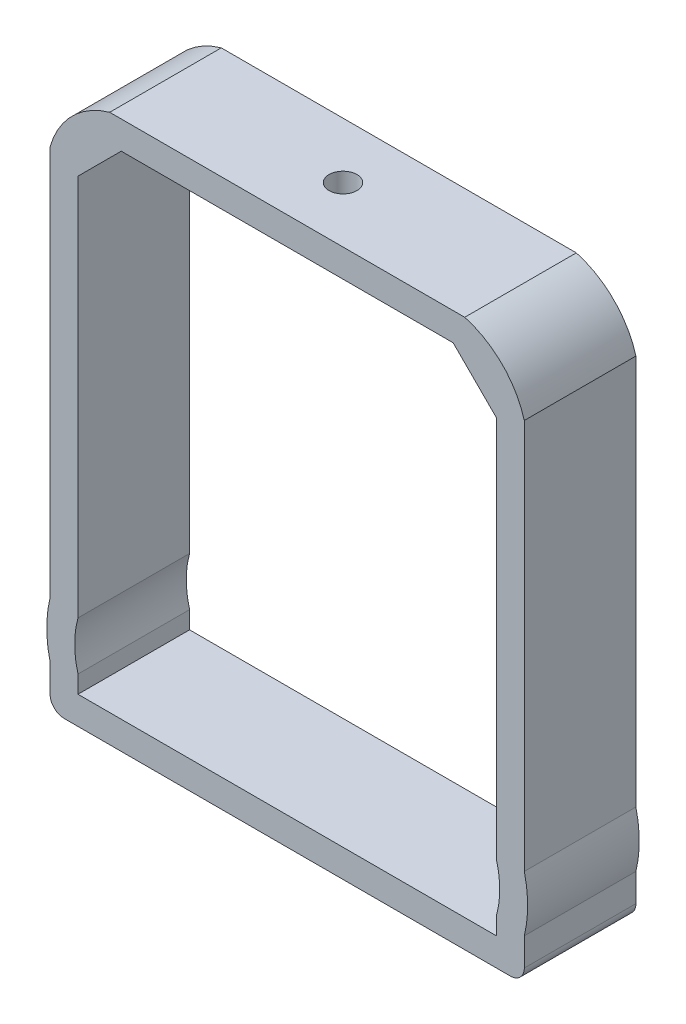
ISO-10303-21;
HEADER;
FILE_DESCRIPTION(('STEP AP214'),'2;1');
FILE_NAME('part.step','',(''),(''),'','','');
FILE_SCHEMA(('AUTOMOTIVE_DESIGN { 1 0 10303 214 1 1 1 1 }'));
ENDSEC;
DATA;
#1=APPLICATION_CONTEXT('core data for automotive mechanical design processes');
#2=APPLICATION_PROTOCOL_DEFINITION('international standard','automotive_design',2000,#1);
#3=PRODUCT_CONTEXT('',#1,'mechanical');
#4=PRODUCT('Part','Part','',(#3));
#5=PRODUCT_RELATED_PRODUCT_CATEGORY('part','',(#4));
#6=PRODUCT_DEFINITION_FORMATION('','',#4);
#7=PRODUCT_DEFINITION_CONTEXT('part definition',#1,'design');
#8=PRODUCT_DEFINITION('design','',#6,#7);
#9=PRODUCT_DEFINITION_SHAPE('','',#8);
#10=(LENGTH_UNIT() NAMED_UNIT(*) SI_UNIT(.MILLI.,.METRE.));
#11=(NAMED_UNIT(*) PLANE_ANGLE_UNIT() SI_UNIT($,.RADIAN.));
#12=(NAMED_UNIT(*) SI_UNIT($,.STERADIAN.) SOLID_ANGLE_UNIT());
#13=UNCERTAINTY_MEASURE_WITH_UNIT(LENGTH_MEASURE(1.E-05),#10,'distance_accuracy_value','');
#14=(GEOMETRIC_REPRESENTATION_CONTEXT(3) GLOBAL_UNCERTAINTY_ASSIGNED_CONTEXT((#13)) GLOBAL_UNIT_ASSIGNED_CONTEXT((#10,
#11,#12)) REPRESENTATION_CONTEXT('',''));
#15=CARTESIAN_POINT('',(0.,0.,0.));
#16=DIRECTION('',(0.,0.,1.));
#17=DIRECTION('',(1.,0.,0.));
#18=AXIS2_PLACEMENT_3D('',#15,#16,#17);
#19=CARTESIAN_POINT('',(-20.,3.95620485219663,25.));
#20=DIRECTION('',(0.,0.,-1.));
#21=DIRECTION('',(-1.,0.,0.));
#22=AXIS2_PLACEMENT_3D('',#19,#20,#21);
#23=PLANE('',#22);
#24=CARTESIAN_POINT('',(13.7937056948543,44.3399509566073,25.));
#25=DIRECTION('',(0.,0.,-1.));
#26=DIRECTION('',(-1.,0.,0.));
#27=AXIS2_PLACEMENT_3D('',#24,#25,#26);
#28=CIRCLE('',#27,7.75079707614288);
#29=CARTESIAN_POINT('',(15.9099595904436,51.796245261753,25.));
#30=VERTEX_POINT('',#29);
#31=CARTESIAN_POINT('',(21.25,46.4562048521966,25.));
#32=VERTEX_POINT('',#31);
#33=EDGE_CURVE('E192',#30,#32,#28,.T.);
#34=ORIENTED_EDGE('',*,*,#33,.F.);
#35=DIRECTION('',(-1.,0.,0.));
#36=VECTOR('',#35,1.);
#37=CARTESIAN_POINT('',(15.9099595904437,51.796245261753,25.));
#38=LINE('',#37,#36);
#39=CARTESIAN_POINT('',(-15.9099595904436,51.796245261753,25.));
#40=VERTEX_POINT('',#39);
#41=EDGE_CURVE('E205',#30,#40,#38,.T.);
#42=ORIENTED_EDGE('',*,*,#41,.T.);
#43=CARTESIAN_POINT('',(-13.7937056948543,44.3399509566073,25.));
#44=DIRECTION('',(0.,0.,1.));
#45=DIRECTION('',(1.,0.,0.));
#46=AXIS2_PLACEMENT_3D('',#43,#44,#45);
#47=CIRCLE('',#46,7.75079707614288);
#48=CARTESIAN_POINT('',(-21.25,46.4562048521966,25.));
#49=VERTEX_POINT('',#48);
#50=EDGE_CURVE('E350',#40,#49,#47,.T.);
#51=ORIENTED_EDGE('',*,*,#50,.T.);
#52=DIRECTION('',(0.,-1.,0.));
#53=VECTOR('',#52,1.);
#54=CARTESIAN_POINT('',(-21.25,11.4562048521966,25.));
#55=LINE('',#54,#53);
#56=CARTESIAN_POINT('',(-21.25,11.4562048521966,25.));
#57=VERTEX_POINT('',#56);
#58=EDGE_CURVE('E213',#49,#57,#55,.T.);
#59=ORIENTED_EDGE('',*,*,#58,.T.);
#60=CARTESIAN_POINT('',(-11.0000137976765,8.95620485219663,25.));
#61=DIRECTION('',(0.,0.,1.));
#62=DIRECTION('',(1.,0.,0.));
#63=AXIS2_PLACEMENT_3D('',#60,#61,#62);
#64=CIRCLE('',#63,10.5504605182818);
#65=CARTESIAN_POINT('',(-21.25,6.45620485219663,25.));
#66=VERTEX_POINT('',#65);
#67=EDGE_CURVE('E215',#57,#66,#64,.T.);
#68=ORIENTED_EDGE('',*,*,#67,.T.);
#69=DIRECTION('',(0.,-1.,0.));
#70=VECTOR('',#69,1.);
#71=CARTESIAN_POINT('',(-21.25,3.95620485219663,25.));
#72=LINE('',#71,#70);
#73=CARTESIAN_POINT('',(-21.25,3.95620485219663,25.));
#74=VERTEX_POINT('',#73);
#75=EDGE_CURVE('E222',#66,#74,#72,.T.);
#76=ORIENTED_EDGE('',*,*,#75,.T.);
#77=CARTESIAN_POINT('',(-20.,3.95620485219663,25.));
#78=DIRECTION('',(0.,0.,1.));
#79=DIRECTION('',(-1.,0.,0.));
#80=AXIS2_PLACEMENT_3D('',#77,#78,#79);
#81=CIRCLE('',#80,1.25);
#82=CARTESIAN_POINT('',(-20.,2.70620485219663,25.));
#83=VERTEX_POINT('',#82);
#84=EDGE_CURVE('E248',#74,#83,#81,.T.);
#85=ORIENTED_EDGE('',*,*,#84,.T.);
#86=DIRECTION('',(1.,0.,0.));
#87=VECTOR('',#86,1.);
#88=CARTESIAN_POINT('',(20.,2.70620485219663,25.));
#89=LINE('',#88,#87);
#90=CARTESIAN_POINT('',(20.,2.70620485219663,25.));
#91=VERTEX_POINT('',#90);
#92=EDGE_CURVE('E298',#83,#91,#89,.T.);
#93=ORIENTED_EDGE('',*,*,#92,.T.);
#94=CARTESIAN_POINT('',(20.,3.95620485219663,25.));
#95=DIRECTION('',(0.,0.,1.));
#96=DIRECTION('',(1.,0.,0.));
#97=AXIS2_PLACEMENT_3D('',#94,#95,#96);
#98=CIRCLE('',#97,1.25);
#99=CARTESIAN_POINT('',(21.25,3.95620485219663,25.));
#100=VERTEX_POINT('',#99);
#101=EDGE_CURVE('E277',#91,#100,#98,.T.);
#102=ORIENTED_EDGE('',*,*,#101,.T.);
#103=DIRECTION('',(0.,1.,0.));
#104=VECTOR('',#103,1.);
#105=CARTESIAN_POINT('',(21.25,3.95620485219664,25.));
#106=LINE('',#105,#104);
#107=CARTESIAN_POINT('',(21.25,6.45620485219663,25.));
#108=VERTEX_POINT('',#107);
#109=EDGE_CURVE('E294',#100,#108,#106,.T.);
#110=ORIENTED_EDGE('',*,*,#109,.T.);
#111=CARTESIAN_POINT('',(11.0000137976765,8.95620485219663,25.));
#112=DIRECTION('',(0.,0.,1.));
#113=DIRECTION('',(-1.,0.,0.));
#114=AXIS2_PLACEMENT_3D('',#111,#112,#113);
#115=CIRCLE('',#114,10.5504605182818);
#116=CARTESIAN_POINT('',(21.25,11.4562048521966,25.));
#117=VERTEX_POINT('',#116);
#118=EDGE_CURVE('E217',#108,#117,#115,.T.);
#119=ORIENTED_EDGE('',*,*,#118,.T.);
#120=DIRECTION('',(0.,1.,0.));
#121=VECTOR('',#120,1.);
#122=CARTESIAN_POINT('',(21.25,11.4562048521966,25.));
#123=LINE('',#122,#121);
#124=EDGE_CURVE('E208',#117,#32,#123,.T.);
#125=ORIENTED_EDGE('',*,*,#124,.T.);
#126=EDGE_LOOP('',(#34,#42,#51,#59,#68,#76,#85,#93,#102,#110,#119,#125));
#127=FACE_BOUND('',#126,.T.);
#128=DIRECTION('',(0.,1.,0.));
#129=VECTOR('',#128,1.);
#130=CARTESIAN_POINT('',(18.75,11.13511017832,25.));
#131=LINE('',#130,#129);
#132=CARTESIAN_POINT('',(18.75,11.13511017832,25.));
#133=VERTEX_POINT('',#132);
#134=CARTESIAN_POINT('',(18.75,45.4206709462639,25.));
#135=VERTEX_POINT('',#134);
#136=EDGE_CURVE('E324',#133,#135,#131,.T.);
#137=ORIENTED_EDGE('',*,*,#136,.F.);
#138=CARTESIAN_POINT('',(11.0000137976765,8.95620485219663,25.));
#139=DIRECTION('',(0.,0.,1.));
#140=DIRECTION('',(-1.,0.,0.));
#141=AXIS2_PLACEMENT_3D('',#138,#139,#140);
#142=CIRCLE('',#141,8.05046051828175);
#143=CARTESIAN_POINT('',(18.75,6.77729952607329,25.));
#144=VERTEX_POINT('',#143);
#145=EDGE_CURVE('E320',#144,#133,#142,.T.);
#146=ORIENTED_EDGE('',*,*,#145,.F.);
#147=DIRECTION('',(0.,1.,0.));
#148=VECTOR('',#147,1.);
#149=CARTESIAN_POINT('',(18.75,5.20620485219664,25.));
#150=LINE('',#149,#148);
#151=CARTESIAN_POINT('',(18.75,5.20620485219664,25.));
#152=VERTEX_POINT('',#151);
#153=EDGE_CURVE('E352',#152,#144,#150,.T.);
#154=ORIENTED_EDGE('',*,*,#153,.F.);
#155=DIRECTION('',(1.,0.,0.));
#156=VECTOR('',#155,1.);
#157=CARTESIAN_POINT('',(18.75,5.20620485219664,25.));
#158=LINE('',#157,#156);
#159=CARTESIAN_POINT('',(-18.75,5.20620485219663,25.));
#160=VERTEX_POINT('',#159);
#161=EDGE_CURVE('E354',#160,#152,#158,.T.);
#162=ORIENTED_EDGE('',*,*,#161,.F.);
#163=DIRECTION('',(0.,-1.,0.));
#164=VECTOR('',#163,1.);
#165=CARTESIAN_POINT('',(-18.75,5.20620485219663,25.));
#166=LINE('',#165,#164);
#167=CARTESIAN_POINT('',(-18.75,6.77729952607328,25.));
#168=VERTEX_POINT('',#167);
#169=EDGE_CURVE('E356',#168,#160,#166,.T.);
#170=ORIENTED_EDGE('',*,*,#169,.F.);
#171=CARTESIAN_POINT('',(-11.0000137976765,8.95620485219663,25.));
#172=DIRECTION('',(0.,0.,1.));
#173=DIRECTION('',(1.,0.,0.));
#174=AXIS2_PLACEMENT_3D('',#171,#172,#173);
#175=CIRCLE('',#174,8.05046051828175);
#176=CARTESIAN_POINT('',(-18.75,11.13511017832,25.));
#177=VERTEX_POINT('',#176);
#178=EDGE_CURVE('E358',#177,#168,#175,.T.);
#179=ORIENTED_EDGE('',*,*,#178,.F.);
#180=DIRECTION('',(0.,-1.,0.));
#181=VECTOR('',#180,1.);
#182=CARTESIAN_POINT('',(-18.75,11.13511017832,25.));
#183=LINE('',#182,#181);
#184=CARTESIAN_POINT('',(-18.75,45.4206709462639,25.));
#185=VERTEX_POINT('',#184);
#186=EDGE_CURVE('E360',#185,#177,#183,.T.);
#187=ORIENTED_EDGE('',*,*,#186,.F.);
#188=DIRECTION('',(-0.707106781186546,-0.707106781186549,0.));
#189=VECTOR('',#188,1.);
#190=CARTESIAN_POINT('',(-18.75,45.4206709462639,25.));
#191=LINE('',#190,#189);
#192=CARTESIAN_POINT('',(-14.8744256845109,49.296245261753,25.));
#193=VERTEX_POINT('',#192);
#194=EDGE_CURVE('E362',#193,#185,#191,.T.);
#195=ORIENTED_EDGE('',*,*,#194,.F.);
#196=DIRECTION('',(-1.,0.,0.));
#197=VECTOR('',#196,1.);
#198=CARTESIAN_POINT('',(14.874425684511,49.296245261753,25.));
#199=LINE('',#198,#197);
#200=CARTESIAN_POINT('',(14.874425684511,49.296245261753,25.));
#201=VERTEX_POINT('',#200);
#202=EDGE_CURVE('E364',#201,#193,#199,.T.);
#203=ORIENTED_EDGE('',*,*,#202,.F.);
#204=DIRECTION('',(-0.707106781186546,0.707106781186549,0.));
#205=VECTOR('',#204,1.);
#206=CARTESIAN_POINT('',(18.75,45.4206709462639,25.));
#207=LINE('',#206,#205);
#208=EDGE_CURVE('E366',#135,#201,#207,.T.);
#209=ORIENTED_EDGE('',*,*,#208,.F.);
#210=EDGE_LOOP('',(#137,#146,#154,#162,#170,#179,#187,#195,#203,#209));
#211=FACE_BOUND('',#210,.T.);
#212=ADVANCED_FACE('F38',(#127,#211),#23,.F.);
#213=CARTESIAN_POINT('',(-20.,3.95620485219663,15.));
#214=DIRECTION('',(0.,0.,-1.));
#215=DIRECTION('',(-1.,0.,0.));
#216=AXIS2_PLACEMENT_3D('',#213,#214,#215);
#217=PLANE('',#216);
#218=DIRECTION('',(-1.,0.,0.));
#219=VECTOR('',#218,1.);
#220=CARTESIAN_POINT('',(15.9099595904437,51.796245261753,15.));
#221=LINE('',#220,#219);
#222=CARTESIAN_POINT('',(15.9099595904437,51.796245261753,15.));
#223=VERTEX_POINT('',#222);
#224=CARTESIAN_POINT('',(-15.9099595904436,51.796245261753,15.));
#225=VERTEX_POINT('',#224);
#226=EDGE_CURVE('E240',#223,#225,#221,.T.);
#227=ORIENTED_EDGE('',*,*,#226,.F.);
#228=CARTESIAN_POINT('',(13.7937056948543,44.3399509566073,15.));
#229=DIRECTION('',(0.,0.,-1.));
#230=DIRECTION('',(-1.,0.,0.));
#231=AXIS2_PLACEMENT_3D('',#228,#229,#230);
#232=CIRCLE('',#231,7.75079707614288);
#233=CARTESIAN_POINT('',(21.25,46.4562048521966,15.));
#234=VERTEX_POINT('',#233);
#235=EDGE_CURVE('E194',#223,#234,#232,.T.);
#236=ORIENTED_EDGE('',*,*,#235,.T.);
#237=DIRECTION('',(0.,1.,0.));
#238=VECTOR('',#237,1.);
#239=CARTESIAN_POINT('',(21.25,11.4562048521966,15.));
#240=LINE('',#239,#238);
#241=CARTESIAN_POINT('',(21.25,11.4562048521966,15.));
#242=VERTEX_POINT('',#241);
#243=EDGE_CURVE('E237',#242,#234,#240,.T.);
#244=ORIENTED_EDGE('',*,*,#243,.F.);
#245=CARTESIAN_POINT('',(11.0000137976765,8.95620485219663,15.));
#246=DIRECTION('',(0.,0.,1.));
#247=DIRECTION('',(-1.,0.,0.));
#248=AXIS2_PLACEMENT_3D('',#245,#246,#247);
#249=CIRCLE('',#248,10.5504605182818);
#250=CARTESIAN_POINT('',(21.25,6.45620485219663,15.));
#251=VERTEX_POINT('',#250);
#252=EDGE_CURVE('E235',#251,#242,#249,.T.);
#253=ORIENTED_EDGE('',*,*,#252,.F.);
#254=DIRECTION('',(0.,1.,0.));
#255=VECTOR('',#254,1.);
#256=CARTESIAN_POINT('',(21.25,3.95620485219664,15.));
#257=LINE('',#256,#255);
#258=CARTESIAN_POINT('',(21.25,3.95620485219663,15.));
#259=VERTEX_POINT('',#258);
#260=EDGE_CURVE('E233',#259,#251,#257,.T.);
#261=ORIENTED_EDGE('',*,*,#260,.F.);
#262=CARTESIAN_POINT('',(20.,3.95620485219663,15.));
#263=DIRECTION('',(0.,0.,1.));
#264=DIRECTION('',(1.,0.,0.));
#265=AXIS2_PLACEMENT_3D('',#262,#263,#264);
#266=CIRCLE('',#265,1.25);
#267=CARTESIAN_POINT('',(20.,2.70620485219663,15.));
#268=VERTEX_POINT('',#267);
#269=EDGE_CURVE('E231',#268,#259,#266,.T.);
#270=ORIENTED_EDGE('',*,*,#269,.F.);
#271=DIRECTION('',(1.,0.,0.));
#272=VECTOR('',#271,1.);
#273=CARTESIAN_POINT('',(20.,2.70620485219663,15.));
#274=LINE('',#273,#272);
#275=CARTESIAN_POINT('',(-20.,2.70620485219663,15.));
#276=VERTEX_POINT('',#275);
#277=EDGE_CURVE('E228',#276,#268,#274,.T.);
#278=ORIENTED_EDGE('',*,*,#277,.F.);
#279=CARTESIAN_POINT('',(-20.,3.95620485219663,15.));
#280=DIRECTION('',(0.,0.,1.));
#281=DIRECTION('',(-1.,0.,0.));
#282=AXIS2_PLACEMENT_3D('',#279,#280,#281);
#283=CIRCLE('',#282,1.25);
#284=CARTESIAN_POINT('',(-21.25,3.95620485219663,15.));
#285=VERTEX_POINT('',#284);
#286=EDGE_CURVE('E225',#285,#276,#283,.T.);
#287=ORIENTED_EDGE('',*,*,#286,.F.);
#288=DIRECTION('',(0.,-1.,0.));
#289=VECTOR('',#288,1.);
#290=CARTESIAN_POINT('',(-21.25,3.95620485219663,15.));
#291=LINE('',#290,#289);
#292=CARTESIAN_POINT('',(-21.25,6.45620485219663,15.));
#293=VERTEX_POINT('',#292);
#294=EDGE_CURVE('E246',#293,#285,#291,.T.);
#295=ORIENTED_EDGE('',*,*,#294,.F.);
#296=CARTESIAN_POINT('',(-11.0000137976765,8.95620485219663,15.));
#297=DIRECTION('',(0.,0.,1.));
#298=DIRECTION('',(1.,0.,0.));
#299=AXIS2_PLACEMENT_3D('',#296,#297,#298);
#300=CIRCLE('',#299,10.5504605182818);
#301=CARTESIAN_POINT('',(-21.25,11.4562048521966,15.));
#302=VERTEX_POINT('',#301);
#303=EDGE_CURVE('E244',#302,#293,#300,.T.);
#304=ORIENTED_EDGE('',*,*,#303,.F.);
#305=DIRECTION('',(0.,-1.,0.));
#306=VECTOR('',#305,1.);
#307=CARTESIAN_POINT('',(-21.25,11.4562048521966,15.));
#308=LINE('',#307,#306);
#309=CARTESIAN_POINT('',(-21.25,46.4562048521966,15.));
#310=VERTEX_POINT('',#309);
#311=EDGE_CURVE('E242',#310,#302,#308,.T.);
#312=ORIENTED_EDGE('',*,*,#311,.F.);
#313=CARTESIAN_POINT('',(-13.7937056948543,44.3399509566073,15.));
#314=DIRECTION('',(0.,0.,1.));
#315=DIRECTION('',(1.,0.,0.));
#316=AXIS2_PLACEMENT_3D('',#313,#314,#315);
#317=CIRCLE('',#316,7.75079707614288);
#318=EDGE_CURVE('E210',#225,#310,#317,.T.);
#319=ORIENTED_EDGE('',*,*,#318,.F.);
#320=EDGE_LOOP('',(#227,#236,#244,#253,#261,#270,#278,#287,#295,#304,#312,#319));
#321=FACE_BOUND('',#320,.T.);
#322=CARTESIAN_POINT('',(11.0000137976765,8.95620485219663,15.));
#323=DIRECTION('',(0.,0.,1.));
#324=DIRECTION('',(-1.,0.,0.));
#325=AXIS2_PLACEMENT_3D('',#322,#323,#324);
#326=CIRCLE('',#325,8.05046051828175);
#327=CARTESIAN_POINT('',(18.75,6.77729952607329,15.));
#328=VERTEX_POINT('',#327);
#329=CARTESIAN_POINT('',(18.75,11.13511017832,15.));
#330=VERTEX_POINT('',#329);
#331=EDGE_CURVE('E321',#328,#330,#326,.T.);
#332=ORIENTED_EDGE('',*,*,#331,.T.);
#333=DIRECTION('',(0.,1.,0.));
#334=VECTOR('',#333,1.);
#335=CARTESIAN_POINT('',(18.75,11.13511017832,15.));
#336=LINE('',#335,#334);
#337=CARTESIAN_POINT('',(18.75,45.4206709462639,15.));
#338=VERTEX_POINT('',#337);
#339=EDGE_CURVE('E61',#330,#338,#336,.T.);
#340=ORIENTED_EDGE('',*,*,#339,.T.);
#341=DIRECTION('',(-0.707106781186546,0.707106781186549,0.));
#342=VECTOR('',#341,1.);
#343=CARTESIAN_POINT('',(18.75,45.4206709462639,15.));
#344=LINE('',#343,#342);
#345=CARTESIAN_POINT('',(14.874425684511,49.296245261753,15.));
#346=VERTEX_POINT('',#345);
#347=EDGE_CURVE('E346',#338,#346,#344,.T.);
#348=ORIENTED_EDGE('',*,*,#347,.T.);
#349=DIRECTION('',(-1.,0.,0.));
#350=VECTOR('',#349,1.);
#351=CARTESIAN_POINT('',(14.874425684511,49.296245261753,15.));
#352=LINE('',#351,#350);
#353=CARTESIAN_POINT('',(-14.8744256845109,49.296245261753,15.));
#354=VERTEX_POINT('',#353);
#355=EDGE_CURVE('E343',#346,#354,#352,.T.);
#356=ORIENTED_EDGE('',*,*,#355,.T.);
#357=DIRECTION('',(-0.707106781186546,-0.707106781186549,0.));
#358=VECTOR('',#357,1.);
#359=CARTESIAN_POINT('',(-18.75,45.4206709462639,15.));
#360=LINE('',#359,#358);
#361=CARTESIAN_POINT('',(-18.75,45.4206709462639,15.));
#362=VERTEX_POINT('',#361);
#363=EDGE_CURVE('E340',#354,#362,#360,.T.);
#364=ORIENTED_EDGE('',*,*,#363,.T.);
#365=DIRECTION('',(0.,-1.,0.));
#366=VECTOR('',#365,1.);
#367=CARTESIAN_POINT('',(-18.75,11.13511017832,15.));
#368=LINE('',#367,#366);
#369=CARTESIAN_POINT('',(-18.75,11.13511017832,15.));
#370=VERTEX_POINT('',#369);
#371=EDGE_CURVE('E337',#362,#370,#368,.T.);
#372=ORIENTED_EDGE('',*,*,#371,.T.);
#373=CARTESIAN_POINT('',(-11.0000137976765,8.95620485219663,15.));
#374=DIRECTION('',(0.,0.,1.));
#375=DIRECTION('',(1.,0.,0.));
#376=AXIS2_PLACEMENT_3D('',#373,#374,#375);
#377=CIRCLE('',#376,8.05046051828175);
#378=CARTESIAN_POINT('',(-18.75,6.77729952607328,15.));
#379=VERTEX_POINT('',#378);
#380=EDGE_CURVE('E334',#370,#379,#377,.T.);
#381=ORIENTED_EDGE('',*,*,#380,.T.);
#382=DIRECTION('',(0.,-1.,0.));
#383=VECTOR('',#382,1.);
#384=CARTESIAN_POINT('',(-18.75,5.20620485219663,15.));
#385=LINE('',#384,#383);
#386=CARTESIAN_POINT('',(-18.75,5.20620485219663,15.));
#387=VERTEX_POINT('',#386);
#388=EDGE_CURVE('E331',#379,#387,#385,.T.);
#389=ORIENTED_EDGE('',*,*,#388,.T.);
#390=DIRECTION('',(1.,0.,0.));
#391=VECTOR('',#390,1.);
#392=CARTESIAN_POINT('',(18.75,5.20620485219664,15.));
#393=LINE('',#392,#391);
#394=CARTESIAN_POINT('',(18.75,5.20620485219664,15.));
#395=VERTEX_POINT('',#394);
#396=EDGE_CURVE('E328',#387,#395,#393,.T.);
#397=ORIENTED_EDGE('',*,*,#396,.T.);
#398=DIRECTION('',(0.,1.,0.));
#399=VECTOR('',#398,1.);
#400=CARTESIAN_POINT('',(18.75,5.20620485219664,15.));
#401=LINE('',#400,#399);
#402=EDGE_CURVE('E325',#395,#328,#401,.T.);
#403=ORIENTED_EDGE('',*,*,#402,.T.);
#404=EDGE_LOOP('',(#332,#340,#348,#356,#364,#372,#381,#389,#397,#403));
#405=FACE_BOUND('',#404,.T.);
#406=ADVANCED_FACE('F281',(#321,#405),#217,.T.);
#407=CARTESIAN_POINT('',(-20.,3.95620485219663,25.));
#408=DIRECTION('',(0.,0.,-1.));
#409=DIRECTION('',(-1.,0.,0.));
#410=AXIS2_PLACEMENT_3D('',#407,#408,#409);
#411=CYLINDRICAL_SURFACE('',#410,1.25);
#412=ORIENTED_EDGE('',*,*,#286,.T.);
#413=DIRECTION('',(0.,0.,-1.));
#414=VECTOR('',#413,1.);
#415=CARTESIAN_POINT('',(-20.,2.70620485219663,25.));
#416=LINE('',#415,#414);
#417=EDGE_CURVE('E11',#83,#276,#416,.T.);
#418=ORIENTED_EDGE('',*,*,#417,.F.);
#419=ORIENTED_EDGE('',*,*,#84,.F.);
#420=DIRECTION('',(0.,0.,-1.));
#421=VECTOR('',#420,1.);
#422=CARTESIAN_POINT('',(-21.25,3.95620485219663,25.));
#423=LINE('',#422,#421);
#424=EDGE_CURVE('E224',#74,#285,#423,.T.);
#425=ORIENTED_EDGE('',*,*,#424,.T.);
#426=EDGE_LOOP('',(#412,#418,#419,#425));
#427=FACE_BOUND('',#426,.T.);
#428=ADVANCED_FACE('F40',(#427),#411,.T.);
#429=CARTESIAN_POINT('',(20.,2.70620485219663,25.));
#430=DIRECTION('',(0.,1.,0.));
#431=DIRECTION('',(-1.,0.,0.));
#432=AXIS2_PLACEMENT_3D('',#429,#430,#431);
#433=PLANE('',#432);
#434=ORIENTED_EDGE('',*,*,#277,.T.);
#435=DIRECTION('',(0.,0.,-1.));
#436=VECTOR('',#435,1.);
#437=CARTESIAN_POINT('',(20.,2.70620485219663,25.));
#438=LINE('',#437,#436);
#439=EDGE_CURVE('E46',#91,#268,#438,.T.);
#440=ORIENTED_EDGE('',*,*,#439,.F.);
#441=ORIENTED_EDGE('',*,*,#92,.F.);
#442=ORIENTED_EDGE('',*,*,#417,.T.);
#443=EDGE_LOOP('',(#434,#440,#441,#442));
#444=FACE_BOUND('',#443,.T.);
#445=ADVANCED_FACE('F552',(#444),#433,.F.);
#446=CARTESIAN_POINT('',(20.,3.95620485219663,25.));
#447=DIRECTION('',(0.,0.,-1.));
#448=DIRECTION('',(-1.,0.,0.));
#449=AXIS2_PLACEMENT_3D('',#446,#447,#448);
#450=CYLINDRICAL_SURFACE('',#449,1.25);
#451=ORIENTED_EDGE('',*,*,#269,.T.);
#452=DIRECTION('',(0.,0.,-1.));
#453=VECTOR('',#452,1.);
#454=CARTESIAN_POINT('',(21.25,3.95620485219663,25.));
#455=LINE('',#454,#453);
#456=EDGE_CURVE('E268',#100,#259,#455,.T.);
#457=ORIENTED_EDGE('',*,*,#456,.F.);
#458=ORIENTED_EDGE('',*,*,#101,.F.);
#459=ORIENTED_EDGE('',*,*,#439,.T.);
#460=EDGE_LOOP('',(#451,#457,#458,#459));
#461=FACE_BOUND('',#460,.T.);
#462=ADVANCED_FACE('F275',(#461),#450,.T.);
#463=CARTESIAN_POINT('',(21.25,3.95620485219664,25.));
#464=DIRECTION('',(-1.,0.,0.));
#465=DIRECTION('',(0.,0.,1.));
#466=AXIS2_PLACEMENT_3D('',#463,#464,#465);
#467=PLANE('',#466);
#468=ORIENTED_EDGE('',*,*,#260,.T.);
#469=DIRECTION('',(0.,0.,-1.));
#470=VECTOR('',#469,1.);
#471=CARTESIAN_POINT('',(21.25,6.45620485219663,25.));
#472=LINE('',#471,#470);
#473=EDGE_CURVE('E265',#108,#251,#472,.T.);
#474=ORIENTED_EDGE('',*,*,#473,.F.);
#475=ORIENTED_EDGE('',*,*,#109,.F.);
#476=ORIENTED_EDGE('',*,*,#456,.T.);
#477=EDGE_LOOP('',(#468,#474,#475,#476));
#478=FACE_BOUND('',#477,.T.);
#479=ADVANCED_FACE('F288',(#478),#467,.F.);
#480=CARTESIAN_POINT('',(11.0000137976765,8.95620485219663,25.));
#481=DIRECTION('',(0.,0.,-1.));
#482=DIRECTION('',(-1.,0.,0.));
#483=AXIS2_PLACEMENT_3D('',#480,#481,#482);
#484=CYLINDRICAL_SURFACE('',#483,10.5504605182818);
#485=ORIENTED_EDGE('',*,*,#252,.T.);
#486=DIRECTION('',(0.,0.,-1.));
#487=VECTOR('',#486,1.);
#488=CARTESIAN_POINT('',(21.25,11.4562048521966,25.));
#489=LINE('',#488,#487);
#490=EDGE_CURVE('E262',#117,#242,#489,.T.);
#491=ORIENTED_EDGE('',*,*,#490,.F.);
#492=ORIENTED_EDGE('',*,*,#118,.F.);
#493=ORIENTED_EDGE('',*,*,#473,.T.);
#494=EDGE_LOOP('',(#485,#491,#492,#493));
#495=FACE_BOUND('',#494,.T.);
#496=ADVANCED_FACE('F292',(#495),#484,.T.);
#497=CARTESIAN_POINT('',(21.25,11.4562048521966,25.));
#498=DIRECTION('',(-1.,0.,0.));
#499=DIRECTION('',(0.,-1.,0.));
#500=AXIS2_PLACEMENT_3D('',#497,#498,#499);
#501=PLANE('',#500);
#502=ORIENTED_EDGE('',*,*,#243,.T.);
#503=DIRECTION('',(0.,0.,-1.));
#504=VECTOR('',#503,1.);
#505=CARTESIAN_POINT('',(21.25,46.4562048521966,25.));
#506=LINE('',#505,#504);
#507=EDGE_CURVE('E199',#32,#234,#506,.T.);
#508=ORIENTED_EDGE('',*,*,#507,.F.);
#509=ORIENTED_EDGE('',*,*,#124,.F.);
#510=ORIENTED_EDGE('',*,*,#490,.T.);
#511=EDGE_LOOP('',(#502,#508,#509,#510));
#512=FACE_BOUND('',#511,.T.);
#513=ADVANCED_FACE('F390',(#512),#501,.F.);
#514=CARTESIAN_POINT('',(15.9099595904437,51.796245261753,25.));
#515=DIRECTION('',(0.,-1.,0.));
#516=DIRECTION('',(1.,0.,0.));
#517=AXIS2_PLACEMENT_3D('',#514,#515,#516);
#518=PLANE('',#517);
#519=CARTESIAN_POINT('',(0.,51.796245261753,20.));
#520=DIRECTION('',(0.,1.,0.));
#521=DIRECTION('',(0.,0.,1.));
#522=AXIS2_PLACEMENT_3D('',#519,#520,#521);
#523=CIRCLE('',#522,1.25);
#524=CARTESIAN_POINT('',(0.,51.796245261753,21.25));
#525=VERTEX_POINT('',#524);
#526=EDGE_CURVE('E373',#525,#525,#523,.T.);
#527=ORIENTED_EDGE('',*,*,#526,.F.);
#528=EDGE_LOOP('',(#527));
#529=FACE_BOUND('',#528,.T.);
#530=ORIENTED_EDGE('',*,*,#226,.T.);
#531=DIRECTION('',(0.,0.,-1.));
#532=VECTOR('',#531,1.);
#533=CARTESIAN_POINT('',(-15.9099595904437,51.796245261753,25.));
#534=LINE('',#533,#532);
#535=EDGE_CURVE('E200',#40,#225,#534,.T.);
#536=ORIENTED_EDGE('',*,*,#535,.F.);
#537=ORIENTED_EDGE('',*,*,#41,.F.);
#538=DIRECTION('',(0.,0.,-1.));
#539=VECTOR('',#538,1.);
#540=CARTESIAN_POINT('',(15.9099595904437,51.796245261753,25.));
#541=LINE('',#540,#539);
#542=EDGE_CURVE('E188',#30,#223,#541,.T.);
#543=ORIENTED_EDGE('',*,*,#542,.T.);
#544=EDGE_LOOP('',(#530,#536,#537,#543));
#545=FACE_BOUND('',#544,.T.);
#546=ADVANCED_FACE('F212',(#529,#545),#518,.F.);
#547=CARTESIAN_POINT('',(-21.25,11.4562048521966,25.));
#548=DIRECTION('',(1.,0.,0.));
#549=DIRECTION('',(0.,0.,-1.));
#550=AXIS2_PLACEMENT_3D('',#547,#548,#549);
#551=PLANE('',#550);
#552=ORIENTED_EDGE('',*,*,#311,.T.);
#553=DIRECTION('',(0.,0.,-1.));
#554=VECTOR('',#553,1.);
#555=CARTESIAN_POINT('',(-21.25,11.4562048521966,25.));
#556=LINE('',#555,#554);
#557=EDGE_CURVE('E254',#57,#302,#556,.T.);
#558=ORIENTED_EDGE('',*,*,#557,.F.);
#559=ORIENTED_EDGE('',*,*,#58,.F.);
#560=DIRECTION('',(0.,0.,-1.));
#561=VECTOR('',#560,1.);
#562=CARTESIAN_POINT('',(-21.25,46.4562048521966,25.));
#563=LINE('',#562,#561);
#564=EDGE_CURVE('E257',#49,#310,#563,.T.);
#565=ORIENTED_EDGE('',*,*,#564,.T.);
#566=EDGE_LOOP('',(#552,#558,#559,#565));
#567=FACE_BOUND('',#566,.T.);
#568=ADVANCED_FACE('F389',(#567),#551,.F.);
#569=CARTESIAN_POINT('',(-11.0000137976765,8.95620485219663,25.));
#570=DIRECTION('',(0.,0.,-1.));
#571=DIRECTION('',(-1.,0.,0.));
#572=AXIS2_PLACEMENT_3D('',#569,#570,#571);
#573=CYLINDRICAL_SURFACE('',#572,10.5504605182818);
#574=ORIENTED_EDGE('',*,*,#303,.T.);
#575=DIRECTION('',(0.,0.,-1.));
#576=VECTOR('',#575,1.);
#577=CARTESIAN_POINT('',(-21.25,6.45620485219663,25.));
#578=LINE('',#577,#576);
#579=EDGE_CURVE('E251',#66,#293,#578,.T.);
#580=ORIENTED_EDGE('',*,*,#579,.F.);
#581=ORIENTED_EDGE('',*,*,#67,.F.);
#582=ORIENTED_EDGE('',*,*,#557,.T.);
#583=EDGE_LOOP('',(#574,#580,#581,#582));
#584=FACE_BOUND('',#583,.T.);
#585=ADVANCED_FACE('F396',(#584),#573,.T.);
#586=CARTESIAN_POINT('',(-21.25,3.95620485219663,25.));
#587=DIRECTION('',(1.,0.,0.));
#588=DIRECTION('',(0.,0.,-1.));
#589=AXIS2_PLACEMENT_3D('',#586,#587,#588);
#590=PLANE('',#589);
#591=ORIENTED_EDGE('',*,*,#294,.T.);
#592=ORIENTED_EDGE('',*,*,#424,.F.);
#593=ORIENTED_EDGE('',*,*,#75,.F.);
#594=ORIENTED_EDGE('',*,*,#579,.T.);
#595=EDGE_LOOP('',(#591,#592,#593,#594));
#596=FACE_BOUND('',#595,.T.);
#597=ADVANCED_FACE('F411',(#596),#590,.F.);
#598=CARTESIAN_POINT('',(18.75,11.13511017832,25.));
#599=DIRECTION('',(-1.,0.,0.));
#600=DIRECTION('',(0.,-1.,0.));
#601=AXIS2_PLACEMENT_3D('',#598,#599,#600);
#602=PLANE('',#601);
#603=ORIENTED_EDGE('',*,*,#339,.F.);
#604=DIRECTION('',(0.,0.,-1.));
#605=VECTOR('',#604,1.);
#606=CARTESIAN_POINT('',(18.75,11.13511017832,25.));
#607=LINE('',#606,#605);
#608=EDGE_CURVE('E318',#133,#330,#607,.T.);
#609=ORIENTED_EDGE('',*,*,#608,.F.);
#610=ORIENTED_EDGE('',*,*,#136,.T.);
#611=DIRECTION('',(0.,0.,-1.));
#612=VECTOR('',#611,1.);
#613=CARTESIAN_POINT('',(18.75,45.4206709462639,25.));
#614=LINE('',#613,#612);
#615=EDGE_CURVE('E229',#135,#338,#614,.T.);
#616=ORIENTED_EDGE('',*,*,#615,.T.);
#617=EDGE_LOOP('',(#603,#609,#610,#616));
#618=FACE_BOUND('',#617,.T.);
#619=ADVANCED_FACE('F408',(#618),#602,.T.);
#620=CARTESIAN_POINT('',(18.75,45.4206709462639,25.));
#621=DIRECTION('',(-0.707106781186549,-0.707106781186546,0.));
#622=DIRECTION('',(0.707106781186546,-0.707106781186549,0.));
#623=AXIS2_PLACEMENT_3D('',#620,#621,#622);
#624=PLANE('',#623);
#625=ORIENTED_EDGE('',*,*,#347,.F.);
#626=ORIENTED_EDGE('',*,*,#615,.F.);
#627=ORIENTED_EDGE('',*,*,#208,.T.);
#628=DIRECTION('',(0.,0.,-1.));
#629=VECTOR('',#628,1.);
#630=CARTESIAN_POINT('',(14.874425684511,49.296245261753,25.));
#631=LINE('',#630,#629);
#632=EDGE_CURVE('E303',#201,#346,#631,.T.);
#633=ORIENTED_EDGE('',*,*,#632,.T.);
#634=EDGE_LOOP('',(#625,#626,#627,#633));
#635=FACE_BOUND('',#634,.T.);
#636=ADVANCED_FACE('F470',(#635),#624,.T.);
#637=CARTESIAN_POINT('',(14.874425684511,49.296245261753,25.));
#638=DIRECTION('',(0.,-1.,0.));
#639=DIRECTION('',(1.,0.,0.));
#640=AXIS2_PLACEMENT_3D('',#637,#638,#639);
#641=PLANE('',#640);
#642=CARTESIAN_POINT('',(0.,49.296245261753,20.));
#643=DIRECTION('',(0.,1.,0.));
#644=DIRECTION('',(0.,0.,1.));
#645=AXIS2_PLACEMENT_3D('',#642,#643,#644);
#646=CIRCLE('',#645,1.25);
#647=CARTESIAN_POINT('',(0.,49.296245261753,21.25));
#648=VERTEX_POINT('',#647);
#649=EDGE_CURVE('E371',#648,#648,#646,.T.);
#650=ORIENTED_EDGE('',*,*,#649,.T.);
#651=EDGE_LOOP('',(#650));
#652=FACE_BOUND('',#651,.T.);
#653=ORIENTED_EDGE('',*,*,#355,.F.);
#654=ORIENTED_EDGE('',*,*,#632,.F.);
#655=ORIENTED_EDGE('',*,*,#202,.T.);
#656=DIRECTION('',(0.,0.,-1.));
#657=VECTOR('',#656,1.);
#658=CARTESIAN_POINT('',(-14.8744256845109,49.296245261753,25.));
#659=LINE('',#658,#657);
#660=EDGE_CURVE('E305',#193,#354,#659,.T.);
#661=ORIENTED_EDGE('',*,*,#660,.T.);
#662=EDGE_LOOP('',(#653,#654,#655,#661));
#663=FACE_BOUND('',#662,.T.);
#664=ADVANCED_FACE('F379',(#652,#663),#641,.T.);
#665=CARTESIAN_POINT('',(-18.75,45.4206709462639,25.));
#666=DIRECTION('',(0.707106781186549,-0.707106781186546,0.));
#667=DIRECTION('',(0.707106781186546,0.707106781186549,0.));
#668=AXIS2_PLACEMENT_3D('',#665,#666,#667);
#669=PLANE('',#668);
#670=ORIENTED_EDGE('',*,*,#363,.F.);
#671=ORIENTED_EDGE('',*,*,#660,.F.);
#672=ORIENTED_EDGE('',*,*,#194,.T.);
#673=DIRECTION('',(0.,0.,-1.));
#674=VECTOR('',#673,1.);
#675=CARTESIAN_POINT('',(-18.75,45.4206709462639,25.));
#676=LINE('',#675,#674);
#677=EDGE_CURVE('E307',#185,#362,#676,.T.);
#678=ORIENTED_EDGE('',*,*,#677,.T.);
#679=EDGE_LOOP('',(#670,#671,#672,#678));
#680=FACE_BOUND('',#679,.T.);
#681=ADVANCED_FACE('F464',(#680),#669,.T.);
#682=CARTESIAN_POINT('',(-18.75,11.13511017832,25.));
#683=DIRECTION('',(1.,0.,0.));
#684=DIRECTION('',(0.,0.,-1.));
#685=AXIS2_PLACEMENT_3D('',#682,#683,#684);
#686=PLANE('',#685);
#687=ORIENTED_EDGE('',*,*,#371,.F.);
#688=ORIENTED_EDGE('',*,*,#677,.F.);
#689=ORIENTED_EDGE('',*,*,#186,.T.);
#690=DIRECTION('',(0.,0.,-1.));
#691=VECTOR('',#690,1.);
#692=CARTESIAN_POINT('',(-18.75,11.13511017832,25.));
#693=LINE('',#692,#691);
#694=EDGE_CURVE('E309',#177,#370,#693,.T.);
#695=ORIENTED_EDGE('',*,*,#694,.T.);
#696=EDGE_LOOP('',(#687,#688,#689,#695));
#697=FACE_BOUND('',#696,.T.);
#698=ADVANCED_FACE('F460',(#697),#686,.T.);
#699=CARTESIAN_POINT('',(-11.0000137976765,8.95620485219663,25.));
#700=DIRECTION('',(0.,0.,-1.));
#701=DIRECTION('',(-1.,0.,0.));
#702=AXIS2_PLACEMENT_3D('',#699,#700,#701);
#703=CYLINDRICAL_SURFACE('',#702,8.05046051828175);
#704=ORIENTED_EDGE('',*,*,#380,.F.);
#705=ORIENTED_EDGE('',*,*,#694,.F.);
#706=ORIENTED_EDGE('',*,*,#178,.T.);
#707=DIRECTION('',(0.,0.,-1.));
#708=VECTOR('',#707,1.);
#709=CARTESIAN_POINT('',(-18.75,6.77729952607328,25.));
#710=LINE('',#709,#708);
#711=EDGE_CURVE('E311',#168,#379,#710,.T.);
#712=ORIENTED_EDGE('',*,*,#711,.T.);
#713=EDGE_LOOP('',(#704,#705,#706,#712));
#714=FACE_BOUND('',#713,.T.);
#715=ADVANCED_FACE('F456',(#714),#703,.F.);
#716=CARTESIAN_POINT('',(-18.75,5.20620485219663,25.));
#717=DIRECTION('',(1.,0.,0.));
#718=DIRECTION('',(0.,0.,-1.));
#719=AXIS2_PLACEMENT_3D('',#716,#717,#718);
#720=PLANE('',#719);
#721=ORIENTED_EDGE('',*,*,#388,.F.);
#722=ORIENTED_EDGE('',*,*,#711,.F.);
#723=ORIENTED_EDGE('',*,*,#169,.T.);
#724=DIRECTION('',(0.,0.,-1.));
#725=VECTOR('',#724,1.);
#726=CARTESIAN_POINT('',(-18.75,5.20620485219663,25.));
#727=LINE('',#726,#725);
#728=EDGE_CURVE('E313',#160,#387,#727,.T.);
#729=ORIENTED_EDGE('',*,*,#728,.T.);
#730=EDGE_LOOP('',(#721,#722,#723,#729));
#731=FACE_BOUND('',#730,.T.);
#732=ADVANCED_FACE('F452',(#731),#720,.T.);
#733=CARTESIAN_POINT('',(18.75,5.20620485219664,25.));
#734=DIRECTION('',(0.,1.,0.));
#735=DIRECTION('',(-1.,0.,0.));
#736=AXIS2_PLACEMENT_3D('',#733,#734,#735);
#737=PLANE('',#736);
#738=ORIENTED_EDGE('',*,*,#396,.F.);
#739=ORIENTED_EDGE('',*,*,#728,.F.);
#740=ORIENTED_EDGE('',*,*,#161,.T.);
#741=DIRECTION('',(0.,0.,-1.));
#742=VECTOR('',#741,1.);
#743=CARTESIAN_POINT('',(18.75,5.20620485219664,25.));
#744=LINE('',#743,#742);
#745=EDGE_CURVE('E315',#152,#395,#744,.T.);
#746=ORIENTED_EDGE('',*,*,#745,.T.);
#747=EDGE_LOOP('',(#738,#739,#740,#746));
#748=FACE_BOUND('',#747,.T.);
#749=ADVANCED_FACE('F448',(#748),#737,.T.);
#750=CARTESIAN_POINT('',(18.75,5.20620485219664,25.));
#751=DIRECTION('',(-1.,0.,0.));
#752=DIRECTION('',(0.,0.,1.));
#753=AXIS2_PLACEMENT_3D('',#750,#751,#752);
#754=PLANE('',#753);
#755=ORIENTED_EDGE('',*,*,#402,.F.);
#756=ORIENTED_EDGE('',*,*,#745,.F.);
#757=ORIENTED_EDGE('',*,*,#153,.T.);
#758=DIRECTION('',(0.,0.,-1.));
#759=VECTOR('',#758,1.);
#760=CARTESIAN_POINT('',(18.75,6.77729952607329,25.));
#761=LINE('',#760,#759);
#762=EDGE_CURVE('E53',#144,#328,#761,.T.);
#763=ORIENTED_EDGE('',*,*,#762,.T.);
#764=EDGE_LOOP('',(#755,#756,#757,#763));
#765=FACE_BOUND('',#764,.T.);
#766=ADVANCED_FACE('F443',(#765),#754,.T.);
#767=CARTESIAN_POINT('',(11.0000137976765,8.95620485219663,25.));
#768=DIRECTION('',(0.,0.,-1.));
#769=DIRECTION('',(-1.,0.,0.));
#770=AXIS2_PLACEMENT_3D('',#767,#768,#769);
#771=CYLINDRICAL_SURFACE('',#770,8.05046051828175);
#772=ORIENTED_EDGE('',*,*,#331,.F.);
#773=ORIENTED_EDGE('',*,*,#762,.F.);
#774=ORIENTED_EDGE('',*,*,#145,.T.);
#775=ORIENTED_EDGE('',*,*,#608,.T.);
#776=EDGE_LOOP('',(#772,#773,#774,#775));
#777=FACE_BOUND('',#776,.T.);
#778=ADVANCED_FACE('F436',(#777),#771,.F.);
#779=CARTESIAN_POINT('',(-13.7937056948543,44.3399509566073,25.));
#780=DIRECTION('',(0.,0.,-1.));
#781=DIRECTION('',(-1.,0.,0.));
#782=AXIS2_PLACEMENT_3D('',#779,#780,#781);
#783=CYLINDRICAL_SURFACE('',#782,7.75079707614288);
#784=ORIENTED_EDGE('',*,*,#318,.T.);
#785=ORIENTED_EDGE('',*,*,#564,.F.);
#786=ORIENTED_EDGE('',*,*,#50,.F.);
#787=ORIENTED_EDGE('',*,*,#535,.T.);
#788=EDGE_LOOP('',(#784,#785,#786,#787));
#789=FACE_BOUND('',#788,.T.);
#790=ADVANCED_FACE('F434',(#789),#783,.T.);
#791=CARTESIAN_POINT('',(13.7937056948543,44.3399509566073,25.));
#792=DIRECTION('',(0.,0.,-1.));
#793=DIRECTION('',(-1.,0.,0.));
#794=AXIS2_PLACEMENT_3D('',#791,#792,#793);
#795=CYLINDRICAL_SURFACE('',#794,7.75079707614288);
#796=ORIENTED_EDGE('',*,*,#235,.F.);
#797=ORIENTED_EDGE('',*,*,#542,.F.);
#798=ORIENTED_EDGE('',*,*,#33,.T.);
#799=ORIENTED_EDGE('',*,*,#507,.T.);
#800=EDGE_LOOP('',(#796,#797,#798,#799));
#801=FACE_BOUND('',#800,.T.);
#802=ADVANCED_FACE('F190',(#801),#795,.T.);
#803=CARTESIAN_POINT('',(0.,49.296245261753,20.));
#804=DIRECTION('',(0.,1.,0.));
#805=DIRECTION('',(0.,0.,1.));
#806=AXIS2_PLACEMENT_3D('',#803,#804,#805);
#807=CYLINDRICAL_SURFACE('',#806,1.25);
#808=ORIENTED_EDGE('',*,*,#649,.F.);
#809=EDGE_LOOP('',(#808));
#810=FACE_BOUND('',#809,.T.);
#811=ORIENTED_EDGE('',*,*,#526,.T.);
#812=EDGE_LOOP('',(#811));
#813=FACE_BOUND('',#812,.T.);
#814=ADVANCED_FACE('F382',(#810,#813),#807,.F.);
#815=CLOSED_SHELL('',(#212,#406,#428,#445,#462,#479,#496,#513,#546,#568,#585,#597,#619,#636,
#664,#681,#698,#715,#732,#749,#766,#778,#790,#802,#814));
#816=MANIFOLD_SOLID_BREP('B2',#815);
#817=ADVANCED_BREP_SHAPE_REPRESENTATION('',(#18,#816),#14);
#818=SHAPE_DEFINITION_REPRESENTATION(#9,#817);
ENDSEC;
END-ISO-10303-21;
